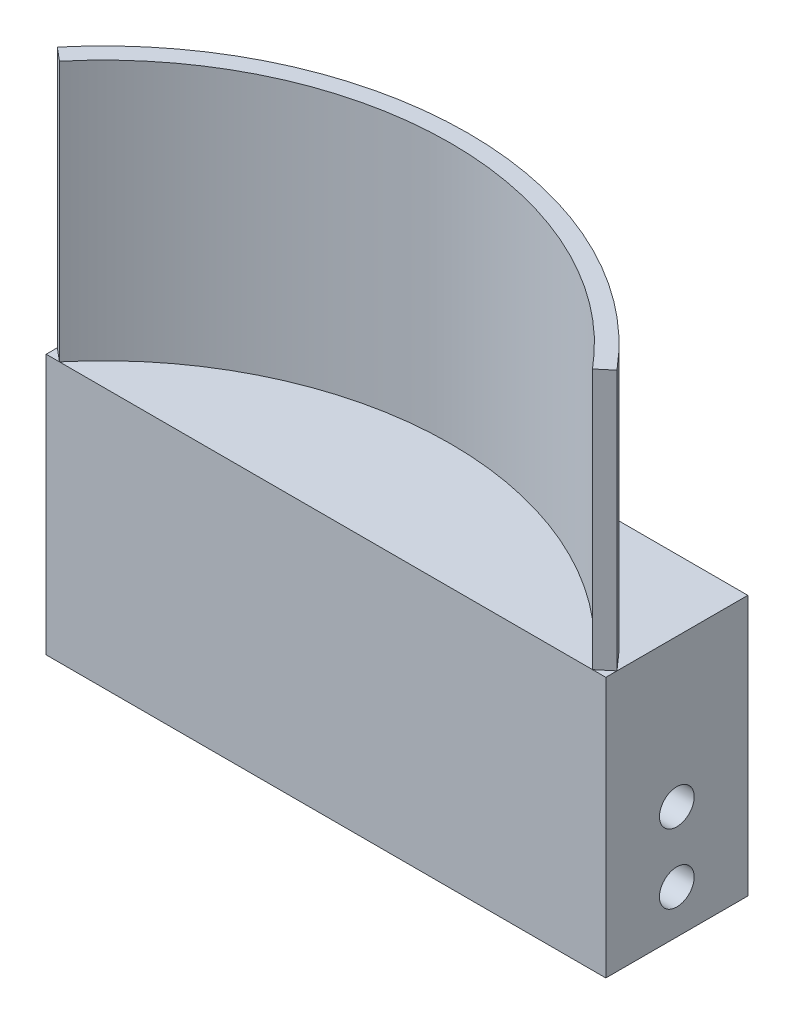
ISO-10303-21;
HEADER;
FILE_DESCRIPTION(('STEP AP214'),'2;1');
FILE_NAME('part.step','',(''),(''),'','','');
FILE_SCHEMA(('AUTOMOTIVE_DESIGN { 1 0 10303 214 1 1 1 1 }'));
ENDSEC;
DATA;
#1=APPLICATION_CONTEXT('core data for automotive mechanical design processes');
#2=APPLICATION_PROTOCOL_DEFINITION('international standard','automotive_design',2000,#1);
#3=PRODUCT_CONTEXT('',#1,'mechanical');
#4=PRODUCT('Part','Part','',(#3));
#5=PRODUCT_RELATED_PRODUCT_CATEGORY('part','',(#4));
#6=PRODUCT_DEFINITION_FORMATION('','',#4);
#7=PRODUCT_DEFINITION_CONTEXT('part definition',#1,'design');
#8=PRODUCT_DEFINITION('design','',#6,#7);
#9=PRODUCT_DEFINITION_SHAPE('','',#8);
#10=(LENGTH_UNIT() NAMED_UNIT(*) SI_UNIT(.MILLI.,.METRE.));
#11=(NAMED_UNIT(*) PLANE_ANGLE_UNIT() SI_UNIT($,.RADIAN.));
#12=(NAMED_UNIT(*) SI_UNIT($,.STERADIAN.) SOLID_ANGLE_UNIT());
#13=UNCERTAINTY_MEASURE_WITH_UNIT(LENGTH_MEASURE(1.E-05),#10,'distance_accuracy_value','');
#14=(GEOMETRIC_REPRESENTATION_CONTEXT(3) GLOBAL_UNCERTAINTY_ASSIGNED_CONTEXT((#13)) GLOBAL_UNIT_ASSIGNED_CONTEXT((#10,
#11,#12)) REPRESENTATION_CONTEXT('',''));
#15=CARTESIAN_POINT('',(0.,0.,0.));
#16=DIRECTION('',(0.,0.,1.));
#17=DIRECTION('',(1.,0.,0.));
#18=AXIS2_PLACEMENT_3D('',#15,#16,#17);
#19=CARTESIAN_POINT('',(0.,15.,0.));
#20=DIRECTION('',(0.,-1.,0.));
#21=DIRECTION('',(0.,0.,-1.));
#22=AXIS2_PLACEMENT_3D('',#19,#20,#21);
#23=CYLINDRICAL_SURFACE('',#22,20.);
#24=CARTESIAN_POINT('',(0.,0.,0.));
#25=DIRECTION('',(0.,-1.,0.));
#26=DIRECTION('',(0.,0.,-1.));
#27=AXIS2_PLACEMENT_3D('',#24,#25,#26);
#28=CIRCLE('',#27,20.);
#29=CARTESIAN_POINT('',(-15.350868461924,0.,-12.8199390585411));
#30=VERTEX_POINT('',#29);
#31=CARTESIAN_POINT('',(15.350868461924,0.,-12.8199390585411));
#32=VERTEX_POINT('',#31);
#33=EDGE_CURVE('E131',#30,#32,#28,.T.);
#34=ORIENTED_EDGE('',*,*,#33,.T.);
#35=DIRECTION('',(0.,-1.,0.));
#36=VECTOR('',#35,1.);
#37=CARTESIAN_POINT('',(15.350868461924,15.,-12.8199390585411));
#38=LINE('',#37,#36);
#39=CARTESIAN_POINT('',(15.350868461924,15.,-12.8199390585411));
#40=VERTEX_POINT('',#39);
#41=EDGE_CURVE('E11',#40,#32,#38,.T.);
#42=ORIENTED_EDGE('',*,*,#41,.F.);
#43=CARTESIAN_POINT('',(0.,15.,0.));
#44=DIRECTION('',(0.,-1.,0.));
#45=DIRECTION('',(0.,0.,-1.));
#46=AXIS2_PLACEMENT_3D('',#43,#44,#45);
#47=CIRCLE('',#46,20.);
#48=CARTESIAN_POINT('',(-15.350868461924,15.,-12.8199390585411));
#49=VERTEX_POINT('',#48);
#50=EDGE_CURVE('E140',#49,#40,#47,.T.);
#51=ORIENTED_EDGE('',*,*,#50,.F.);
#52=DIRECTION('',(0.,-1.,0.));
#53=VECTOR('',#52,1.);
#54=CARTESIAN_POINT('',(-15.350868461924,15.,-12.8199390585411));
#55=LINE('',#54,#53);
#56=EDGE_CURVE('E147',#49,#30,#55,.T.);
#57=ORIENTED_EDGE('',*,*,#56,.T.);
#58=EDGE_LOOP('',(#34,#42,#51,#57));
#59=FACE_BOUND('',#58,.T.);
#60=ADVANCED_FACE('F41',(#59),#23,.F.);
#61=CARTESIAN_POINT('',(16.1184118850202,15.,-13.4609360114681));
#62=DIRECTION('',(-0.640996952927054,0.,-0.7675434230962));
#63=DIRECTION('',(-0.7675434230962,0.,0.640996952927054));
#64=AXIS2_PLACEMENT_3D('',#61,#62,#63);
#65=PLANE('',#64);
#66=DIRECTION('',(0.7675434230962,0.,-0.640996952927054));
#67=VECTOR('',#66,1.);
#68=CARTESIAN_POINT('',(16.1184118850202,0.,-13.4609360114681));
#69=LINE('',#68,#67);
#70=CARTESIAN_POINT('',(16.1184118850202,0.,-13.4609360114681));
#71=VERTEX_POINT('',#70);
#72=EDGE_CURVE('E134',#32,#71,#69,.T.);
#73=ORIENTED_EDGE('',*,*,#72,.T.);
#74=DIRECTION('',(0.,-1.,0.));
#75=VECTOR('',#74,1.);
#76=CARTESIAN_POINT('',(16.1184118850202,15.,-13.4609360114681));
#77=LINE('',#76,#75);
#78=CARTESIAN_POINT('',(16.1184118850202,15.,-13.4609360114681));
#79=VERTEX_POINT('',#78);
#80=EDGE_CURVE('E49',#79,#71,#77,.T.);
#81=ORIENTED_EDGE('',*,*,#80,.F.);
#82=DIRECTION('',(0.7675434230962,0.,-0.640996952927054));
#83=VECTOR('',#82,1.);
#84=CARTESIAN_POINT('',(16.1184118850202,15.,-13.4609360114681));
#85=LINE('',#84,#83);
#86=EDGE_CURVE('E142',#40,#79,#85,.T.);
#87=ORIENTED_EDGE('',*,*,#86,.F.);
#88=ORIENTED_EDGE('',*,*,#41,.T.);
#89=EDGE_LOOP('',(#73,#81,#87,#88));
#90=FACE_BOUND('',#89,.T.);
#91=ADVANCED_FACE('F171',(#90),#65,.F.);
#92=CARTESIAN_POINT('',(0.,15.,0.));
#93=DIRECTION('',(0.,-1.,0.));
#94=DIRECTION('',(0.,0.,-1.));
#95=AXIS2_PLACEMENT_3D('',#92,#93,#94);
#96=CYLINDRICAL_SURFACE('',#95,21.);
#97=CARTESIAN_POINT('',(0.,0.,0.));
#98=DIRECTION('',(0.,1.,0.));
#99=DIRECTION('',(0.,0.,-1.));
#100=AXIS2_PLACEMENT_3D('',#97,#98,#99);
#101=CIRCLE('',#100,21.);
#102=CARTESIAN_POINT('',(0.,0.,-21.));
#103=VERTEX_POINT('',#102);
#104=EDGE_CURVE('E152',#71,#103,#101,.T.);
#105=ORIENTED_EDGE('',*,*,#104,.T.);
#106=CARTESIAN_POINT('',(-16.1184118850202,0.,-13.4609360114681));
#107=VERTEX_POINT('',#106);
#108=EDGE_CURVE('E151',#103,#107,#101,.T.);
#109=ORIENTED_EDGE('',*,*,#108,.T.);
#110=DIRECTION('',(0.,-1.,0.));
#111=VECTOR('',#110,1.);
#112=CARTESIAN_POINT('',(-16.1184118850202,15.,-13.4609360114681));
#113=LINE('',#112,#111);
#114=CARTESIAN_POINT('',(-16.1184118850202,15.,-13.4609360114681));
#115=VERTEX_POINT('',#114);
#116=EDGE_CURVE('E159',#115,#107,#113,.T.);
#117=ORIENTED_EDGE('',*,*,#116,.F.);
#118=CARTESIAN_POINT('',(0.,15.,0.));
#119=DIRECTION('',(0.,1.,0.));
#120=DIRECTION('',(0.,0.,-1.));
#121=AXIS2_PLACEMENT_3D('',#118,#119,#120);
#122=CIRCLE('',#121,21.);
#123=EDGE_CURVE('E145',#79,#115,#122,.T.);
#124=ORIENTED_EDGE('',*,*,#123,.F.);
#125=ORIENTED_EDGE('',*,*,#80,.T.);
#126=EDGE_LOOP('',(#105,#109,#117,#124,#125));
#127=FACE_BOUND('',#126,.T.);
#128=ADVANCED_FACE('F165',(#127),#96,.T.);
#129=CARTESIAN_POINT('',(-16.1184118850202,15.,-13.4609360114681));
#130=DIRECTION('',(0.640996952927058,0.,-0.767543423096197));
#131=DIRECTION('',(-0.767543423096197,0.,-0.640996952927058));
#132=AXIS2_PLACEMENT_3D('',#129,#130,#131);
#133=PLANE('',#132);
#134=DIRECTION('',(0.767543423096197,0.,0.640996952927058));
#135=VECTOR('',#134,1.);
#136=CARTESIAN_POINT('',(-16.1184118850202,0.,-13.4609360114681));
#137=LINE('',#136,#135);
#138=EDGE_CURVE('E143',#107,#30,#137,.T.);
#139=ORIENTED_EDGE('',*,*,#138,.T.);
#140=ORIENTED_EDGE('',*,*,#56,.F.);
#141=DIRECTION('',(0.767543423096197,0.,0.640996952927058));
#142=VECTOR('',#141,1.);
#143=CARTESIAN_POINT('',(-16.1184118850202,15.,-13.4609360114681));
#144=LINE('',#143,#142);
#145=EDGE_CURVE('E56',#115,#49,#144,.T.);
#146=ORIENTED_EDGE('',*,*,#145,.F.);
#147=ORIENTED_EDGE('',*,*,#116,.T.);
#148=EDGE_LOOP('',(#139,#140,#146,#147));
#149=FACE_BOUND('',#148,.T.);
#150=ADVANCED_FACE('F255',(#149),#133,.F.);
#151=CARTESIAN_POINT('',(0.,15.,0.));
#152=DIRECTION('',(0.,-1.,0.));
#153=DIRECTION('',(0.,0.,-1.));
#154=AXIS2_PLACEMENT_3D('',#151,#152,#153);
#155=PLANE('',#154);
#156=ORIENTED_EDGE('',*,*,#50,.T.);
#157=ORIENTED_EDGE('',*,*,#86,.T.);
#158=ORIENTED_EDGE('',*,*,#123,.T.);
#159=ORIENTED_EDGE('',*,*,#145,.T.);
#160=EDGE_LOOP('',(#156,#157,#158,#159));
#161=FACE_BOUND('',#160,.T.);
#162=ADVANCED_FACE('F274',(#161),#155,.F.);
#163=CARTESIAN_POINT('',(0.,0.,0.));
#164=DIRECTION('',(0.,-1.,0.));
#165=DIRECTION('',(0.,0.,-1.));
#166=AXIS2_PLACEMENT_3D('',#163,#164,#165);
#167=PLANE('',#166);
#168=ORIENTED_EDGE('',*,*,#138,.F.);
#169=DIRECTION('',(0.,0.,-1.));
#170=VECTOR('',#169,1.);
#171=CARTESIAN_POINT('',(-16.1184118850202,0.,-12.8199390585411));
#172=LINE('',#171,#170);
#173=CARTESIAN_POINT('',(-16.1184118850202,0.,-12.8199390585411));
#174=VERTEX_POINT('',#173);
#175=EDGE_CURVE('E200',#174,#107,#172,.T.);
#176=ORIENTED_EDGE('',*,*,#175,.F.);
#177=DIRECTION('',(-1.,0.,0.));
#178=VECTOR('',#177,1.);
#179=CARTESIAN_POINT('',(-16.1184118850202,0.,-12.8199390585411));
#180=LINE('',#179,#178);
#181=EDGE_CURVE('E186',#30,#174,#180,.T.);
#182=ORIENTED_EDGE('',*,*,#181,.F.);
#183=EDGE_LOOP('',(#168,#176,#182));
#184=FACE_BOUND('',#183,.T.);
#185=ADVANCED_FACE('F244',(#184),#167,.F.);
#186=ORIENTED_EDGE('',*,*,#108,.F.);
#187=DIRECTION('',(1.,0.,0.));
#188=VECTOR('',#187,1.);
#189=CARTESIAN_POINT('',(-16.1184118850202,0.,-21.));
#190=LINE('',#189,#188);
#191=CARTESIAN_POINT('',(-16.1184118850202,0.,-21.));
#192=VERTEX_POINT('',#191);
#193=EDGE_CURVE('E196',#192,#103,#190,.T.);
#194=ORIENTED_EDGE('',*,*,#193,.F.);
#195=EDGE_CURVE('E129',#107,#192,#172,.T.);
#196=ORIENTED_EDGE('',*,*,#195,.F.);
#197=EDGE_LOOP('',(#186,#194,#196));
#198=FACE_BOUND('',#197,.T.);
#199=ADVANCED_FACE('F259',(#198),#167,.F.);
#200=ORIENTED_EDGE('',*,*,#33,.F.);
#201=EDGE_CURVE('E182',#32,#30,#180,.T.);
#202=ORIENTED_EDGE('',*,*,#201,.F.);
#203=EDGE_LOOP('',(#200,#202));
#204=FACE_BOUND('',#203,.T.);
#205=ADVANCED_FACE('F183',(#204),#167,.F.);
#206=ORIENTED_EDGE('',*,*,#104,.F.);
#207=DIRECTION('',(0.,0.,1.));
#208=VECTOR('',#207,1.);
#209=CARTESIAN_POINT('',(16.1184118850202,0.,-12.8199390585411));
#210=LINE('',#209,#208);
#211=CARTESIAN_POINT('',(16.1184118850202,0.,-21.));
#212=VERTEX_POINT('',#211);
#213=EDGE_CURVE('E193',#212,#71,#210,.T.);
#214=ORIENTED_EDGE('',*,*,#213,.F.);
#215=EDGE_CURVE('E199',#103,#212,#190,.T.);
#216=ORIENTED_EDGE('',*,*,#215,.F.);
#217=EDGE_LOOP('',(#206,#214,#216));
#218=FACE_BOUND('',#217,.T.);
#219=ADVANCED_FACE('F245',(#218),#167,.F.);
#220=CARTESIAN_POINT('',(-16.1184118850202,-15.,-12.8199390585411));
#221=DIRECTION('',(1.,0.,0.));
#222=DIRECTION('',(0.,0.,-1.));
#223=AXIS2_PLACEMENT_3D('',#220,#221,#222);
#224=PLANE('',#223);
#225=ORIENTED_EDGE('',*,*,#175,.T.);
#226=ORIENTED_EDGE('',*,*,#195,.T.);
#227=DIRECTION('',(0.,1.,0.));
#228=VECTOR('',#227,1.);
#229=CARTESIAN_POINT('',(-16.1184118850202,-15.,-21.));
#230=LINE('',#229,#228);
#231=CARTESIAN_POINT('',(-16.1184118850202,-15.,-21.));
#232=VERTEX_POINT('',#231);
#233=EDGE_CURVE('E109',#232,#192,#230,.T.);
#234=ORIENTED_EDGE('',*,*,#233,.F.);
#235=DIRECTION('',(0.,0.,-1.));
#236=VECTOR('',#235,1.);
#237=CARTESIAN_POINT('',(-16.1184118850202,-15.,-12.8199390585411));
#238=LINE('',#237,#236);
#239=CARTESIAN_POINT('',(-16.1184118850202,-15.,-12.8199390585411));
#240=VERTEX_POINT('',#239);
#241=EDGE_CURVE('E115',#240,#232,#238,.T.);
#242=ORIENTED_EDGE('',*,*,#241,.F.);
#243=DIRECTION('',(0.,1.,0.));
#244=VECTOR('',#243,1.);
#245=CARTESIAN_POINT('',(-16.1184118850202,-15.,-12.8199390585411));
#246=LINE('',#245,#244);
#247=EDGE_CURVE('E203',#240,#174,#246,.T.);
#248=ORIENTED_EDGE('',*,*,#247,.T.);
#249=EDGE_LOOP('',(#225,#226,#234,#242,#248));
#250=FACE_BOUND('',#249,.T.);
#251=ADVANCED_FACE('F127',(#250),#224,.F.);
#252=CARTESIAN_POINT('',(-16.1184118850202,-15.,-21.));
#253=DIRECTION('',(0.,0.,1.));
#254=DIRECTION('',(1.,0.,0.));
#255=AXIS2_PLACEMENT_3D('',#252,#253,#254);
#256=PLANE('',#255);
#257=ORIENTED_EDGE('',*,*,#193,.T.);
#258=ORIENTED_EDGE('',*,*,#215,.T.);
#259=DIRECTION('',(0.,1.,0.));
#260=VECTOR('',#259,1.);
#261=CARTESIAN_POINT('',(16.1184118850202,-15.,-21.));
#262=LINE('',#261,#260);
#263=CARTESIAN_POINT('',(16.1184118850202,-15.,-21.));
#264=VERTEX_POINT('',#263);
#265=EDGE_CURVE('E111',#264,#212,#262,.T.);
#266=ORIENTED_EDGE('',*,*,#265,.F.);
#267=DIRECTION('',(1.,0.,0.));
#268=VECTOR('',#267,1.);
#269=CARTESIAN_POINT('',(-16.1184118850202,-15.,-21.));
#270=LINE('',#269,#268);
#271=EDGE_CURVE('E104',#232,#264,#270,.T.);
#272=ORIENTED_EDGE('',*,*,#271,.F.);
#273=ORIENTED_EDGE('',*,*,#233,.T.);
#274=EDGE_LOOP('',(#257,#258,#266,#272,#273));
#275=FACE_BOUND('',#274,.T.);
#276=ADVANCED_FACE('F107',(#275),#256,.F.);
#277=CARTESIAN_POINT('',(16.1184118850202,-15.,-12.8199390585411));
#278=DIRECTION('',(-1.,0.,0.));
#279=DIRECTION('',(0.,0.,1.));
#280=AXIS2_PLACEMENT_3D('',#277,#278,#279);
#281=PLANE('',#280);
#282=CARTESIAN_POINT('',(16.1184118850202,-12.5,-16.9099695292705));
#283=DIRECTION('',(1.,0.,0.));
#284=DIRECTION('',(0.,0.,-1.));
#285=AXIS2_PLACEMENT_3D('',#282,#283,#284);
#286=CIRCLE('',#285,1.);
#287=CARTESIAN_POINT('',(16.1184118850202,-12.5,-17.9099695292705));
#288=VERTEX_POINT('',#287);
#289=EDGE_CURVE('E211',#288,#288,#286,.T.);
#290=ORIENTED_EDGE('',*,*,#289,.F.);
#291=EDGE_LOOP('',(#290));
#292=FACE_BOUND('',#291,.T.);
#293=CARTESIAN_POINT('',(16.1184118850202,-8.5,-16.9099695292705));
#294=DIRECTION('',(1.,0.,0.));
#295=DIRECTION('',(0.,0.,-1.));
#296=AXIS2_PLACEMENT_3D('',#293,#294,#295);
#297=CIRCLE('',#296,1.);
#298=CARTESIAN_POINT('',(16.1184118850202,-8.5,-17.9099695292705));
#299=VERTEX_POINT('',#298);
#300=EDGE_CURVE('E208',#299,#299,#297,.T.);
#301=ORIENTED_EDGE('',*,*,#300,.F.);
#302=EDGE_LOOP('',(#301));
#303=FACE_BOUND('',#302,.T.);
#304=ORIENTED_EDGE('',*,*,#213,.T.);
#305=CARTESIAN_POINT('',(16.1184118850202,0.,-12.8199390585411));
#306=VERTEX_POINT('',#305);
#307=EDGE_CURVE('E179',#71,#306,#210,.T.);
#308=ORIENTED_EDGE('',*,*,#307,.T.);
#309=DIRECTION('',(0.,1.,0.));
#310=VECTOR('',#309,1.);
#311=CARTESIAN_POINT('',(16.1184118850202,-15.,-12.8199390585411));
#312=LINE('',#311,#310);
#313=CARTESIAN_POINT('',(16.1184118850202,-15.,-12.8199390585411));
#314=VERTEX_POINT('',#313);
#315=EDGE_CURVE('E136',#314,#306,#312,.T.);
#316=ORIENTED_EDGE('',*,*,#315,.F.);
#317=DIRECTION('',(0.,0.,1.));
#318=VECTOR('',#317,1.);
#319=CARTESIAN_POINT('',(16.1184118850202,-15.,-12.8199390585411));
#320=LINE('',#319,#318);
#321=EDGE_CURVE('E114',#264,#314,#320,.T.);
#322=ORIENTED_EDGE('',*,*,#321,.F.);
#323=ORIENTED_EDGE('',*,*,#265,.T.);
#324=EDGE_LOOP('',(#304,#308,#316,#322,#323));
#325=FACE_BOUND('',#324,.T.);
#326=ADVANCED_FACE('F227',(#292,#303,#325),#281,.F.);
#327=CARTESIAN_POINT('',(-16.1184118850202,-15.,-12.8199390585411));
#328=DIRECTION('',(0.,0.,-1.));
#329=DIRECTION('',(-1.,0.,0.));
#330=AXIS2_PLACEMENT_3D('',#327,#328,#329);
#331=PLANE('',#330);
#332=EDGE_CURVE('E124',#306,#32,#180,.T.);
#333=ORIENTED_EDGE('',*,*,#332,.T.);
#334=ORIENTED_EDGE('',*,*,#201,.T.);
#335=ORIENTED_EDGE('',*,*,#181,.T.);
#336=ORIENTED_EDGE('',*,*,#247,.F.);
#337=DIRECTION('',(-1.,0.,0.));
#338=VECTOR('',#337,1.);
#339=CARTESIAN_POINT('',(-16.1184118850202,-15.,-12.8199390585411));
#340=LINE('',#339,#338);
#341=EDGE_CURVE('E120',#314,#240,#340,.T.);
#342=ORIENTED_EDGE('',*,*,#341,.F.);
#343=ORIENTED_EDGE('',*,*,#315,.T.);
#344=EDGE_LOOP('',(#333,#334,#335,#336,#342,#343));
#345=FACE_BOUND('',#344,.T.);
#346=ADVANCED_FACE('F189',(#345),#331,.F.);
#347=CARTESIAN_POINT('',(0.,-15.,0.));
#348=DIRECTION('',(0.,-1.,0.));
#349=DIRECTION('',(0.,0.,-1.));
#350=AXIS2_PLACEMENT_3D('',#347,#348,#349);
#351=PLANE('',#350);
#352=ORIENTED_EDGE('',*,*,#241,.T.);
#353=ORIENTED_EDGE('',*,*,#271,.T.);
#354=ORIENTED_EDGE('',*,*,#321,.T.);
#355=ORIENTED_EDGE('',*,*,#341,.T.);
#356=EDGE_LOOP('',(#352,#353,#354,#355));
#357=FACE_BOUND('',#356,.T.);
#358=ADVANCED_FACE('F118',(#357),#351,.T.);
#359=ORIENTED_EDGE('',*,*,#72,.F.);
#360=ORIENTED_EDGE('',*,*,#332,.F.);
#361=ORIENTED_EDGE('',*,*,#307,.F.);
#362=EDGE_LOOP('',(#359,#360,#361));
#363=FACE_BOUND('',#362,.T.);
#364=ADVANCED_FACE('F177',(#363),#167,.F.);
#365=CARTESIAN_POINT('',(1.1184118850202,-8.5,-16.9099695292705));
#366=DIRECTION('',(1.,0.,0.));
#367=DIRECTION('',(0.,0.,-1.));
#368=AXIS2_PLACEMENT_3D('',#365,#366,#367);
#369=CYLINDRICAL_SURFACE('',#368,1.);
#370=CARTESIAN_POINT('',(1.1184118850202,-8.5,-16.9099695292705));
#371=DIRECTION('',(1.,0.,0.));
#372=DIRECTION('',(0.,0.,-1.));
#373=AXIS2_PLACEMENT_3D('',#370,#371,#372);
#374=CIRCLE('',#373,1.);
#375=CARTESIAN_POINT('',(1.1184118850202,-8.5,-17.9099695292705));
#376=VERTEX_POINT('',#375);
#377=EDGE_CURVE('E205',#376,#376,#374,.T.);
#378=ORIENTED_EDGE('',*,*,#377,.F.);
#379=EDGE_LOOP('',(#378));
#380=FACE_BOUND('',#379,.T.);
#381=ORIENTED_EDGE('',*,*,#300,.T.);
#382=EDGE_LOOP('',(#381));
#383=FACE_BOUND('',#382,.T.);
#384=ADVANCED_FACE('F233',(#380,#383),#369,.F.);
#385=CARTESIAN_POINT('',(1.1184118850202,-8.5,-16.9099695292705));
#386=DIRECTION('',(1.,0.,0.));
#387=DIRECTION('',(0.,0.,-1.));
#388=AXIS2_PLACEMENT_3D('',#385,#386,#387);
#389=PLANE('',#388);
#390=ORIENTED_EDGE('',*,*,#377,.T.);
#391=EDGE_LOOP('',(#390));
#392=FACE_BOUND('',#391,.T.);
#393=ADVANCED_FACE('F223',(#392),#389,.T.);
#394=CARTESIAN_POINT('',(1.1184118850202,-12.5,-16.9099695292705));
#395=DIRECTION('',(1.,0.,0.));
#396=DIRECTION('',(0.,0.,-1.));
#397=AXIS2_PLACEMENT_3D('',#394,#395,#396);
#398=CYLINDRICAL_SURFACE('',#397,1.);
#399=CARTESIAN_POINT('',(1.1184118850202,-12.5,-16.9099695292705));
#400=DIRECTION('',(1.,0.,0.));
#401=DIRECTION('',(0.,0.,-1.));
#402=AXIS2_PLACEMENT_3D('',#399,#400,#401);
#403=CIRCLE('',#402,1.);
#404=CARTESIAN_POINT('',(1.1184118850202,-12.5,-17.9099695292705));
#405=VERTEX_POINT('',#404);
#406=EDGE_CURVE('E214',#405,#405,#403,.T.);
#407=ORIENTED_EDGE('',*,*,#406,.F.);
#408=EDGE_LOOP('',(#407));
#409=FACE_BOUND('',#408,.T.);
#410=ORIENTED_EDGE('',*,*,#289,.T.);
#411=EDGE_LOOP('',(#410));
#412=FACE_BOUND('',#411,.T.);
#413=ADVANCED_FACE('F220',(#409,#412),#398,.F.);
#414=CARTESIAN_POINT('',(1.1184118850202,-12.5,-16.9099695292705));
#415=DIRECTION('',(1.,0.,0.));
#416=DIRECTION('',(0.,0.,-1.));
#417=AXIS2_PLACEMENT_3D('',#414,#415,#416);
#418=PLANE('',#417);
#419=ORIENTED_EDGE('',*,*,#406,.T.);
#420=EDGE_LOOP('',(#419));
#421=FACE_BOUND('',#420,.T.);
#422=ADVANCED_FACE('F218',(#421),#418,.T.);
#423=CLOSED_SHELL('',(#60,#91,#128,#150,#162,#185,#199,#205,#219,#251,#276,#326,#346,#358,#364,
#384,#393,#413,#422));
#424=MANIFOLD_SOLID_BREP('B2',#423);
#425=ADVANCED_BREP_SHAPE_REPRESENTATION('',(#18,#424),#14);
#426=SHAPE_DEFINITION_REPRESENTATION(#9,#425);
ENDSEC;
END-ISO-10303-21;
